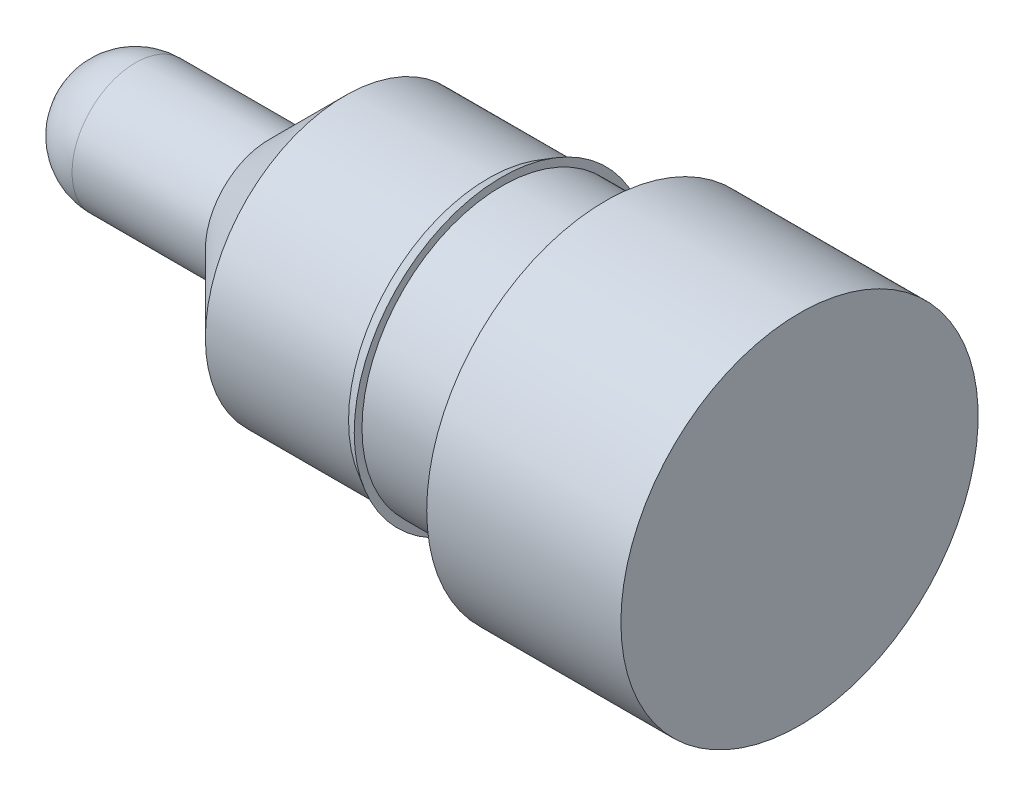
ISO-10303-21;
HEADER;
FILE_DESCRIPTION(('STEP AP214'),'2;1');
FILE_NAME('part.step','',(''),(''),'','','');
FILE_SCHEMA(('AUTOMOTIVE_DESIGN { 1 0 10303 214 1 1 1 1 }'));
ENDSEC;
DATA;
#1=APPLICATION_CONTEXT('core data for automotive mechanical design processes');
#2=APPLICATION_PROTOCOL_DEFINITION('international standard','automotive_design',2000,#1);
#3=PRODUCT_CONTEXT('',#1,'mechanical');
#4=PRODUCT('Part','Part','',(#3));
#5=PRODUCT_RELATED_PRODUCT_CATEGORY('part','',(#4));
#6=PRODUCT_DEFINITION_FORMATION('','',#4);
#7=PRODUCT_DEFINITION_CONTEXT('part definition',#1,'design');
#8=PRODUCT_DEFINITION('design','',#6,#7);
#9=PRODUCT_DEFINITION_SHAPE('','',#8);
#10=(LENGTH_UNIT() NAMED_UNIT(*) SI_UNIT(.MILLI.,.METRE.));
#11=(NAMED_UNIT(*) PLANE_ANGLE_UNIT() SI_UNIT($,.RADIAN.));
#12=(NAMED_UNIT(*) SI_UNIT($,.STERADIAN.) SOLID_ANGLE_UNIT());
#13=UNCERTAINTY_MEASURE_WITH_UNIT(LENGTH_MEASURE(1.E-05),#10,'distance_accuracy_value','');
#14=(GEOMETRIC_REPRESENTATION_CONTEXT(3) GLOBAL_UNCERTAINTY_ASSIGNED_CONTEXT((#13)) GLOBAL_UNIT_ASSIGNED_CONTEXT((#10,
#11,#12)) REPRESENTATION_CONTEXT('',''));
#15=CARTESIAN_POINT('',(0.,0.,0.));
#16=DIRECTION('',(0.,0.,1.));
#17=DIRECTION('',(1.,0.,0.));
#18=AXIS2_PLACEMENT_3D('',#15,#16,#17);
#19=CARTESIAN_POINT('',(-2.17367574512431,0.,0.));
#20=DIRECTION('',(-1.,0.,0.));
#21=DIRECTION('',(0.,0.,1.));
#22=AXIS2_PLACEMENT_3D('',#19,#20,#21);
#23=CYLINDRICAL_SURFACE('',#22,0.6223);
#24=CARTESIAN_POINT('',(0.6223,0.,0.));
#25=DIRECTION('',(-1.,0.,0.));
#26=DIRECTION('',(0.,0.,1.));
#27=AXIS2_PLACEMENT_3D('',#24,#25,#26);
#28=CIRCLE('',#27,0.6223);
#29=CARTESIAN_POINT('',(0.6223,0.,0.6223));
#30=VERTEX_POINT('',#29);
#31=EDGE_CURVE('E49',#30,#30,#28,.T.);
#32=ORIENTED_EDGE('',*,*,#31,.F.);
#33=EDGE_LOOP('',(#32));
#34=FACE_BOUND('',#33,.T.);
#35=CARTESIAN_POINT('',(1.9304,0.,0.));
#36=DIRECTION('',(-1.,0.,0.));
#37=DIRECTION('',(0.,0.,1.));
#38=AXIS2_PLACEMENT_3D('',#35,#36,#37);
#39=CIRCLE('',#38,0.6223);
#40=CARTESIAN_POINT('',(1.9304,0.,0.6223));
#41=VERTEX_POINT('',#40);
#42=EDGE_CURVE('E11',#41,#41,#39,.T.);
#43=ORIENTED_EDGE('',*,*,#42,.T.);
#44=EDGE_LOOP('',(#43));
#45=FACE_BOUND('',#44,.T.);
#46=ADVANCED_FACE('F33',(#34,#45),#23,.T.);
#47=CARTESIAN_POINT('',(2.6797,0.,0.));
#48=DIRECTION('',(1.,0.,0.));
#49=DIRECTION('',(0.,0.,-1.));
#50=AXIS2_PLACEMENT_3D('',#47,#48,#49);
#51=CONICAL_SURFACE('',#50,1.3716,0.78539816339745);
#52=ORIENTED_EDGE('',*,*,#42,.F.);
#53=EDGE_LOOP('',(#52));
#54=FACE_BOUND('',#53,.T.);
#55=CARTESIAN_POINT('',(2.6797,0.,0.));
#56=DIRECTION('',(-1.,0.,0.));
#57=DIRECTION('',(0.,0.,1.));
#58=AXIS2_PLACEMENT_3D('',#55,#56,#57);
#59=CIRCLE('',#58,1.3716);
#60=CARTESIAN_POINT('',(2.6797,0.,1.3716));
#61=VERTEX_POINT('',#60);
#62=EDGE_CURVE('E39',#61,#61,#59,.T.);
#63=ORIENTED_EDGE('',*,*,#62,.T.);
#64=EDGE_LOOP('',(#63));
#65=FACE_BOUND('',#64,.T.);
#66=ADVANCED_FACE('F73',(#54,#65),#51,.T.);
#67=CARTESIAN_POINT('',(-2.17367574512431,0.,0.));
#68=DIRECTION('',(-1.,0.,0.));
#69=DIRECTION('',(0.,0.,1.));
#70=AXIS2_PLACEMENT_3D('',#67,#68,#69);
#71=CYLINDRICAL_SURFACE('',#70,1.3716);
#72=ORIENTED_EDGE('',*,*,#62,.F.);
#73=EDGE_LOOP('',(#72));
#74=FACE_BOUND('',#73,.T.);
#75=CARTESIAN_POINT('',(4.08441772846325,0.,0.));
#76=DIRECTION('',(-1.,0.,0.));
#77=DIRECTION('',(0.,0.,1.));
#78=AXIS2_PLACEMENT_3D('',#75,#76,#77);
#79=CIRCLE('',#78,1.3716);
#80=CARTESIAN_POINT('',(4.08441772846325,0.,1.3716));
#81=VERTEX_POINT('',#80);
#82=EDGE_CURVE('E68',#81,#81,#79,.T.);
#83=ORIENTED_EDGE('',*,*,#82,.T.);
#84=EDGE_LOOP('',(#83));
#85=FACE_BOUND('',#84,.T.);
#86=ADVANCED_FACE('F75',(#74,#85),#71,.T.);
#87=CARTESIAN_POINT('',(4.2164,0.,0.));
#88=DIRECTION('',(1.,0.,0.));
#89=DIRECTION('',(0.,0.,-1.));
#90=AXIS2_PLACEMENT_3D('',#87,#88,#89);
#91=CONICAL_SURFACE('',#90,1.4478,0.5235987755983);
#92=ORIENTED_EDGE('',*,*,#82,.F.);
#93=EDGE_LOOP('',(#92));
#94=FACE_BOUND('',#93,.T.);
#95=CARTESIAN_POINT('',(4.2164,0.,0.));
#96=DIRECTION('',(-1.,0.,0.));
#97=DIRECTION('',(0.,0.,1.));
#98=AXIS2_PLACEMENT_3D('',#95,#96,#97);
#99=CIRCLE('',#98,1.4478);
#100=CARTESIAN_POINT('',(4.2164,0.,1.4478));
#101=VERTEX_POINT('',#100);
#102=EDGE_CURVE('E65',#101,#101,#99,.T.);
#103=ORIENTED_EDGE('',*,*,#102,.T.);
#104=EDGE_LOOP('',(#103));
#105=FACE_BOUND('',#104,.T.);
#106=ADVANCED_FACE('F78',(#94,#105),#91,.T.);
#107=CARTESIAN_POINT('',(4.2164,1.4478,0.));
#108=DIRECTION('',(-1.,0.,0.));
#109=DIRECTION('',(0.,0.,1.));
#110=AXIS2_PLACEMENT_3D('',#107,#108,#109);
#111=PLANE('',#110);
#112=ORIENTED_EDGE('',*,*,#102,.F.);
#113=EDGE_LOOP('',(#112));
#114=FACE_BOUND('',#113,.T.);
#115=CARTESIAN_POINT('',(4.2164,0.,0.));
#116=DIRECTION('',(-1.,0.,0.));
#117=DIRECTION('',(0.,0.,1.));
#118=AXIS2_PLACEMENT_3D('',#115,#116,#117);
#119=CIRCLE('',#118,1.3716);
#120=CARTESIAN_POINT('',(4.2164,0.,1.3716));
#121=VERTEX_POINT('',#120);
#122=EDGE_CURVE('E62',#121,#121,#119,.T.);
#123=ORIENTED_EDGE('',*,*,#122,.T.);
#124=EDGE_LOOP('',(#123));
#125=FACE_BOUND('',#124,.T.);
#126=ADVANCED_FACE('F84',(#114,#125),#111,.F.);
#127=CARTESIAN_POINT('',(-2.17367574512431,0.,0.));
#128=DIRECTION('',(-1.,0.,0.));
#129=DIRECTION('',(0.,0.,1.));
#130=AXIS2_PLACEMENT_3D('',#127,#128,#129);
#131=CYLINDRICAL_SURFACE('',#130,1.3716);
#132=ORIENTED_EDGE('',*,*,#122,.F.);
#133=EDGE_LOOP('',(#132));
#134=FACE_BOUND('',#133,.T.);
#135=CARTESIAN_POINT('',(5.2324,0.,0.));
#136=DIRECTION('',(-1.,0.,0.));
#137=DIRECTION('',(0.,0.,1.));
#138=AXIS2_PLACEMENT_3D('',#135,#136,#137);
#139=CIRCLE('',#138,1.3716);
#140=CARTESIAN_POINT('',(5.2324,0.,1.3716));
#141=VERTEX_POINT('',#140);
#142=EDGE_CURVE('E59',#141,#141,#139,.T.);
#143=ORIENTED_EDGE('',*,*,#142,.T.);
#144=EDGE_LOOP('',(#143));
#145=FACE_BOUND('',#144,.T.);
#146=ADVANCED_FACE('F90',(#134,#145),#131,.T.);
#147=CARTESIAN_POINT('',(5.2324,1.3716,0.));
#148=DIRECTION('',(1.,0.,0.));
#149=DIRECTION('',(0.,0.,-1.));
#150=AXIS2_PLACEMENT_3D('',#147,#148,#149);
#151=PLANE('',#150);
#152=ORIENTED_EDGE('',*,*,#142,.F.);
#153=EDGE_LOOP('',(#152));
#154=FACE_BOUND('',#153,.T.);
#155=CARTESIAN_POINT('',(5.2324,0.,0.));
#156=DIRECTION('',(-1.,0.,0.));
#157=DIRECTION('',(0.,0.,1.));
#158=AXIS2_PLACEMENT_3D('',#155,#156,#157);
#159=CIRCLE('',#158,1.7526);
#160=CARTESIAN_POINT('',(5.2324,0.,1.7526));
#161=VERTEX_POINT('',#160);
#162=EDGE_CURVE('E54',#161,#161,#159,.T.);
#163=ORIENTED_EDGE('',*,*,#162,.T.);
#164=EDGE_LOOP('',(#163));
#165=FACE_BOUND('',#164,.T.);
#166=ADVANCED_FACE('F96',(#154,#165),#151,.F.);
#167=CARTESIAN_POINT('',(-2.17367574512431,0.,0.));
#168=DIRECTION('',(-1.,0.,0.));
#169=DIRECTION('',(0.,0.,1.));
#170=AXIS2_PLACEMENT_3D('',#167,#168,#169);
#171=CYLINDRICAL_SURFACE('',#170,1.7526);
#172=ORIENTED_EDGE('',*,*,#162,.F.);
#173=EDGE_LOOP('',(#172));
#174=FACE_BOUND('',#173,.T.);
#175=CARTESIAN_POINT('',(7.1374,0.,0.));
#176=DIRECTION('',(-1.,0.,0.));
#177=DIRECTION('',(0.,0.,1.));
#178=AXIS2_PLACEMENT_3D('',#175,#176,#177);
#179=CIRCLE('',#178,1.7526);
#180=CARTESIAN_POINT('',(7.1374,0.,1.7526));
#181=VERTEX_POINT('',#180);
#182=EDGE_CURVE('E51',#181,#181,#179,.T.);
#183=ORIENTED_EDGE('',*,*,#182,.T.);
#184=EDGE_LOOP('',(#183));
#185=FACE_BOUND('',#184,.T.);
#186=ADVANCED_FACE('F102',(#174,#185),#171,.T.);
#187=CARTESIAN_POINT('',(7.1374,1.7526,0.));
#188=DIRECTION('',(-1.,0.,0.));
#189=DIRECTION('',(0.,0.,1.));
#190=AXIS2_PLACEMENT_3D('',#187,#188,#189);
#191=PLANE('',#190);
#192=ORIENTED_EDGE('',*,*,#182,.F.);
#193=EDGE_LOOP('',(#192));
#194=FACE_BOUND('',#193,.T.);
#195=ADVANCED_FACE('F45',(#194),#191,.F.);
#196=CARTESIAN_POINT('',(0.6223,0.,0.));
#197=DIRECTION('',(-1.,0.,0.));
#198=DIRECTION('',(0.,-1.,0.));
#199=AXIS2_PLACEMENT_3D('',#196,#197,#198);
#200=SPHERICAL_SURFACE('',#199,0.6223);
#201=CARTESIAN_POINT('',(0.,0.,0.));
#202=VERTEX_POINT('',#201);
#203=VERTEX_LOOP('',#202);
#204=FACE_BOUND('',#203,.T.);
#205=ORIENTED_EDGE('',*,*,#31,.T.);
#206=EDGE_LOOP('',(#205));
#207=FACE_BOUND('',#206,.T.);
#208=ADVANCED_FACE('F42',(#204,#207),#200,.T.);
#209=CLOSED_SHELL('',(#46,#66,#86,#106,#126,#146,#166,#186,#195,#208));
#210=MANIFOLD_SOLID_BREP('B2',#209);
#211=ADVANCED_BREP_SHAPE_REPRESENTATION('',(#18,#210),#14);
#212=SHAPE_DEFINITION_REPRESENTATION(#9,#211);
ENDSEC;
END-ISO-10303-21;
